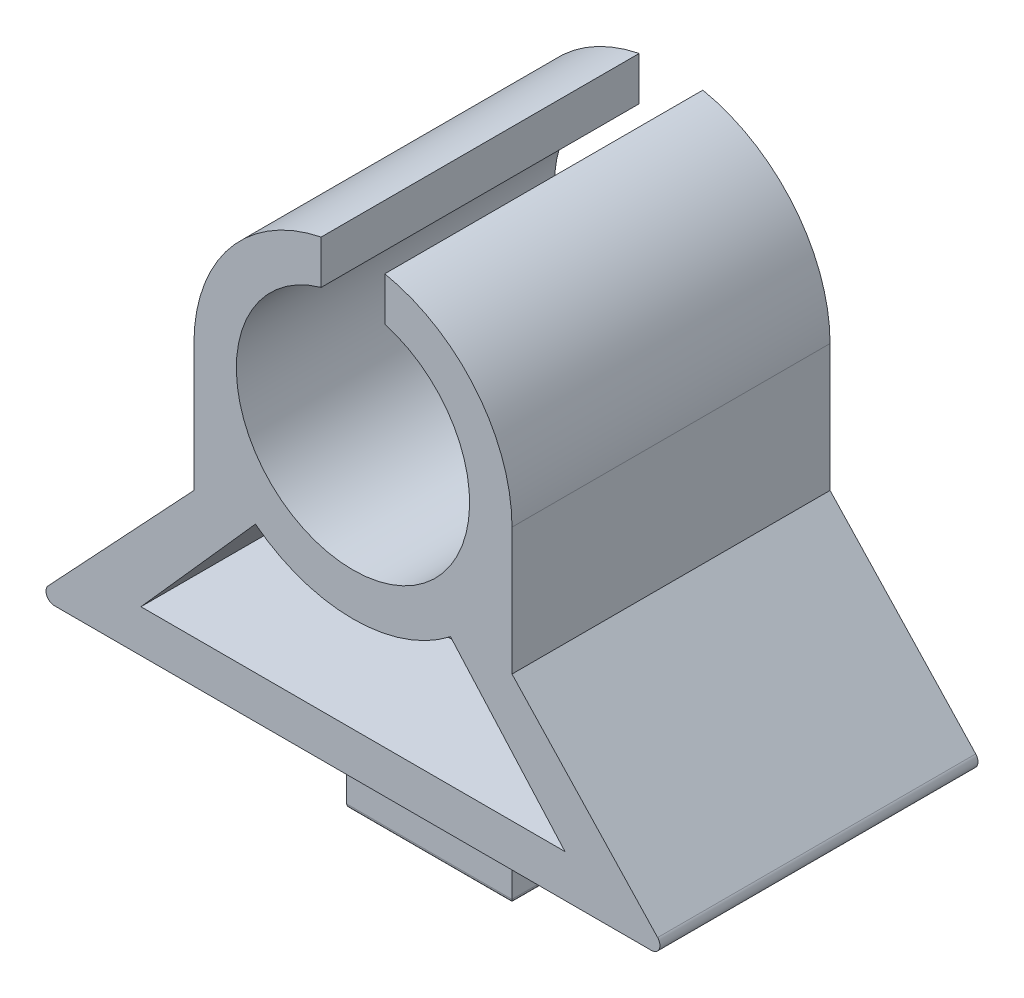
ISO-10303-21;
HEADER;
FILE_DESCRIPTION(('STEP AP214'),'2;1');
FILE_NAME('part.step','',(''),(''),'','','');
FILE_SCHEMA(('AUTOMOTIVE_DESIGN { 1 0 10303 214 1 1 1 1 }'));
ENDSEC;
DATA;
#1=APPLICATION_CONTEXT('core data for automotive mechanical design processes');
#2=APPLICATION_PROTOCOL_DEFINITION('international standard','automotive_design',2000,#1);
#3=PRODUCT_CONTEXT('',#1,'mechanical');
#4=PRODUCT('Part','Part','',(#3));
#5=PRODUCT_RELATED_PRODUCT_CATEGORY('part','',(#4));
#6=PRODUCT_DEFINITION_FORMATION('','',#4);
#7=PRODUCT_DEFINITION_CONTEXT('part definition',#1,'design');
#8=PRODUCT_DEFINITION('design','',#6,#7);
#9=PRODUCT_DEFINITION_SHAPE('','',#8);
#10=(LENGTH_UNIT() NAMED_UNIT(*) SI_UNIT(.MILLI.,.METRE.));
#11=(NAMED_UNIT(*) PLANE_ANGLE_UNIT() SI_UNIT($,.RADIAN.));
#12=(NAMED_UNIT(*) SI_UNIT($,.STERADIAN.) SOLID_ANGLE_UNIT());
#13=UNCERTAINTY_MEASURE_WITH_UNIT(LENGTH_MEASURE(1.E-05),#10,'distance_accuracy_value','');
#14=(GEOMETRIC_REPRESENTATION_CONTEXT(3) GLOBAL_UNCERTAINTY_ASSIGNED_CONTEXT((#13)) GLOBAL_UNIT_ASSIGNED_CONTEXT((#10,
#11,#12)) REPRESENTATION_CONTEXT('',''));
#15=CARTESIAN_POINT('',(0.,0.,0.));
#16=DIRECTION('',(0.,0.,1.));
#17=DIRECTION('',(1.,0.,0.));
#18=AXIS2_PLACEMENT_3D('',#15,#16,#17);
#19=CARTESIAN_POINT('',(0.,7.,-3.75));
#20=DIRECTION('',(0.,0.,1.));
#21=DIRECTION('',(1.,0.,0.));
#22=AXIS2_PLACEMENT_3D('',#19,#20,#21);
#23=PLANE('',#22);
#24=DIRECTION('',(1.,0.,0.));
#25=VECTOR('',#24,1.);
#26=CARTESIAN_POINT('',(-7.5,0.,-3.75));
#27=LINE('',#26,#25);
#28=CARTESIAN_POINT('',(-7.03835359750673,0.,-3.75));
#29=VERTEX_POINT('',#28);
#30=CARTESIAN_POINT('',(7.03835359750673,0.,-3.75));
#31=VERTEX_POINT('',#30);
#32=EDGE_CURVE('E384',#29,#31,#27,.T.);
#33=ORIENTED_EDGE('',*,*,#32,.F.);
#34=CARTESIAN_POINT('',(-7.03835359750673,0.2,-3.75));
#35=DIRECTION('',(0.,0.,1.));
#36=DIRECTION('',(1.,0.,0.));
#37=AXIS2_PLACEMENT_3D('',#34,#35,#36);
#38=CIRCLE('',#37,0.2);
#39=CARTESIAN_POINT('',(-7.18426103833475,0.336788225776266,-3.75));
#40=VERTEX_POINT('',#39);
#41=EDGE_CURVE('E444',#29,#40,#38,.F.);
#42=ORIENTED_EDGE('',*,*,#41,.T.);
#43=DIRECTION('',(-0.68394112888133,-0.729537204140085,0.));
#44=VECTOR('',#43,1.);
#45=CARTESIAN_POINT('',(-7.5,0.,-3.75));
#46=LINE('',#45,#44);
#47=CARTESIAN_POINT('',(-3.75,4.,-3.75));
#48=VERTEX_POINT('',#47);
#49=EDGE_CURVE('E381',#48,#40,#46,.T.);
#50=ORIENTED_EDGE('',*,*,#49,.F.);
#51=DIRECTION('',(0.,-1.,0.));
#52=VECTOR('',#51,1.);
#53=CARTESIAN_POINT('',(-3.75,4.,-3.75));
#54=LINE('',#53,#52);
#55=CARTESIAN_POINT('',(-3.75,7.,-3.75));
#56=VERTEX_POINT('',#55);
#57=EDGE_CURVE('E407',#56,#48,#54,.T.);
#58=ORIENTED_EDGE('',*,*,#57,.F.);
#59=CARTESIAN_POINT('',(0.,7.,-3.75));
#60=DIRECTION('',(0.,0.,1.));
#61=DIRECTION('',(1.,0.,0.));
#62=AXIS2_PLACEMENT_3D('',#59,#60,#61);
#63=CIRCLE('',#62,3.75);
#64=CARTESIAN_POINT('',(-0.75,10.6742346141748,-3.75));
#65=VERTEX_POINT('',#64);
#66=EDGE_CURVE('E404',#65,#56,#63,.T.);
#67=ORIENTED_EDGE('',*,*,#66,.F.);
#68=DIRECTION('',(0.,1.,0.));
#69=VECTOR('',#68,1.);
#70=CARTESIAN_POINT('',(-0.75,9.64575131106459,-3.75));
#71=LINE('',#70,#69);
#72=CARTESIAN_POINT('',(-0.75,9.64575131106459,-3.75));
#73=VERTEX_POINT('',#72);
#74=EDGE_CURVE('E401',#73,#65,#71,.T.);
#75=ORIENTED_EDGE('',*,*,#74,.F.);
#76=CARTESIAN_POINT('',(0.,7.,-3.75));
#77=DIRECTION('',(0.,0.,-1.));
#78=DIRECTION('',(1.,0.,0.));
#79=AXIS2_PLACEMENT_3D('',#76,#77,#78);
#80=CIRCLE('',#79,2.75);
#81=CARTESIAN_POINT('',(0.75,9.64575131106459,-3.75));
#82=VERTEX_POINT('',#81);
#83=EDGE_CURVE('E398',#82,#73,#80,.T.);
#84=ORIENTED_EDGE('',*,*,#83,.F.);
#85=DIRECTION('',(0.,-1.,0.));
#86=VECTOR('',#85,1.);
#87=CARTESIAN_POINT('',(0.75,9.64575131106459,-3.75));
#88=LINE('',#87,#86);
#89=CARTESIAN_POINT('',(0.75,10.6742346141748,-3.75));
#90=VERTEX_POINT('',#89);
#91=EDGE_CURVE('E395',#90,#82,#88,.T.);
#92=ORIENTED_EDGE('',*,*,#91,.F.);
#93=CARTESIAN_POINT('',(0.,7.,-3.75));
#94=DIRECTION('',(0.,0.,1.));
#95=DIRECTION('',(1.,0.,0.));
#96=AXIS2_PLACEMENT_3D('',#93,#94,#95);
#97=CIRCLE('',#96,3.75);
#98=CARTESIAN_POINT('',(3.75,7.,-3.75));
#99=VERTEX_POINT('',#98);
#100=EDGE_CURVE('E392',#99,#90,#97,.T.);
#101=ORIENTED_EDGE('',*,*,#100,.F.);
#102=DIRECTION('',(0.,1.,0.));
#103=VECTOR('',#102,1.);
#104=CARTESIAN_POINT('',(3.75,4.,-3.75));
#105=LINE('',#104,#103);
#106=CARTESIAN_POINT('',(3.75,4.,-3.75));
#107=VERTEX_POINT('',#106);
#108=EDGE_CURVE('E389',#107,#99,#105,.T.);
#109=ORIENTED_EDGE('',*,*,#108,.F.);
#110=DIRECTION('',(-0.68394112888133,0.729537204140085,0.));
#111=VECTOR('',#110,1.);
#112=CARTESIAN_POINT('',(3.75,4.,-3.75));
#113=LINE('',#112,#111);
#114=CARTESIAN_POINT('',(7.18426103833475,0.336788225776265,-3.75));
#115=VERTEX_POINT('',#114);
#116=EDGE_CURVE('E387',#115,#107,#113,.T.);
#117=ORIENTED_EDGE('',*,*,#116,.F.);
#118=CARTESIAN_POINT('',(7.03835359750673,0.2,-3.75));
#119=DIRECTION('',(0.,0.,1.));
#120=DIRECTION('',(1.,0.,0.));
#121=AXIS2_PLACEMENT_3D('',#118,#119,#120);
#122=CIRCLE('',#121,0.2);
#123=EDGE_CURVE('E442',#115,#31,#122,.F.);
#124=ORIENTED_EDGE('',*,*,#123,.T.);
#125=EDGE_LOOP('',(#33,#42,#50,#58,#67,#75,#84,#92,#101,#109,#117,#124));
#126=FACE_BOUND('',#125,.T.);
#127=DIRECTION('',(-0.66436383882992,-0.74740931868366,0.));
#128=VECTOR('',#127,1.);
#129=CARTESIAN_POINT('',(-5.,1.,-3.75));
#130=LINE('',#129,#128);
#131=CARTESIAN_POINT('',(-2.29965323517941,4.03789011042316,-3.75));
#132=VERTEX_POINT('',#131);
#133=CARTESIAN_POINT('',(-5.,1.,-3.75));
#134=VERTEX_POINT('',#133);
#135=EDGE_CURVE('E471',#132,#134,#130,.T.);
#136=ORIENTED_EDGE('',*,*,#135,.T.);
#137=DIRECTION('',(1.,0.,0.));
#138=VECTOR('',#137,1.);
#139=CARTESIAN_POINT('',(-5.,1.,-3.75));
#140=LINE('',#139,#138);
#141=CARTESIAN_POINT('',(5.,1.,-3.75));
#142=VERTEX_POINT('',#141);
#143=EDGE_CURVE('E254',#134,#142,#140,.T.);
#144=ORIENTED_EDGE('',*,*,#143,.T.);
#145=DIRECTION('',(-0.66436383882992,0.74740931868366,0.));
#146=VECTOR('',#145,1.);
#147=CARTESIAN_POINT('',(2.29965323517941,4.03789011042317,-3.75));
#148=LINE('',#147,#146);
#149=CARTESIAN_POINT('',(2.29965323517941,4.03789011042317,-3.75));
#150=VERTEX_POINT('',#149);
#151=EDGE_CURVE('E479',#142,#150,#148,.T.);
#152=ORIENTED_EDGE('',*,*,#151,.T.);
#153=CARTESIAN_POINT('',(0.,7.,-3.75));
#154=DIRECTION('',(0.,0.,-1.));
#155=DIRECTION('',(1.,0.,0.));
#156=AXIS2_PLACEMENT_3D('',#153,#154,#155);
#157=CIRCLE('',#156,3.75);
#158=EDGE_CURVE('E250',#150,#132,#157,.T.);
#159=ORIENTED_EDGE('',*,*,#158,.T.);
#160=EDGE_LOOP('',(#136,#144,#152,#159));
#161=FACE_BOUND('',#160,.T.);
#162=ADVANCED_FACE('F34',(#126,#161),#23,.F.);
#163=CARTESIAN_POINT('',(0.,-2.,-2.));
#164=DIRECTION('',(0.,0.,1.));
#165=DIRECTION('',(1.,0.,0.));
#166=AXIS2_PLACEMENT_3D('',#163,#164,#165);
#167=CYLINDRICAL_SURFACE('',#166,2.);
#168=DIRECTION('',(0.,0.,1.));
#169=VECTOR('',#168,1.);
#170=CARTESIAN_POINT('',(-1.95,-1.55559027913422,-2.));
#171=LINE('',#170,#169);
#172=CARTESIAN_POINT('',(-1.95,-1.55559027913422,-1.95));
#173=VERTEX_POINT('',#172);
#174=CARTESIAN_POINT('',(-1.95,-1.55559027913422,1.95));
#175=VERTEX_POINT('',#174);
#176=EDGE_CURVE('E317',#173,#175,#171,.T.);
#177=ORIENTED_EDGE('',*,*,#176,.T.);
#178=CARTESIAN_POINT('',(0.,-2.,0.));
#179=DIRECTION('',(-0.707106781186547,0.,-0.707106781186547));
#180=DIRECTION('',(-0.707106781186547,0.,0.707106781186547));
#181=AXIS2_PLACEMENT_3D('',#178,#179,#180);
#182=ELLIPSE('',#181,2.82842712474619,2.);
#183=CARTESIAN_POINT('',(-1.5,-0.677124344467705,1.5));
#184=VERTEX_POINT('',#183);
#185=EDGE_CURVE('E302',#184,#175,#182,.F.);
#186=ORIENTED_EDGE('',*,*,#185,.F.);
#187=DIRECTION('',(0.,0.,1.));
#188=VECTOR('',#187,1.);
#189=CARTESIAN_POINT('',(-1.5,-0.677124344467705,-2.));
#190=LINE('',#189,#188);
#191=CARTESIAN_POINT('',(-1.5,-0.677124344467705,-1.5));
#192=VERTEX_POINT('',#191);
#193=EDGE_CURVE('E318',#192,#184,#190,.T.);
#194=ORIENTED_EDGE('',*,*,#193,.F.);
#195=CARTESIAN_POINT('',(0.,-2.,0.));
#196=DIRECTION('',(-0.707106781186547,0.,0.707106781186547));
#197=DIRECTION('',(-0.707106781186547,0.,-0.707106781186547));
#198=AXIS2_PLACEMENT_3D('',#195,#196,#197);
#199=ELLIPSE('',#198,2.82842712474619,2.);
#200=EDGE_CURVE('E305',#173,#192,#199,.F.);
#201=ORIENTED_EDGE('',*,*,#200,.F.);
#202=EDGE_LOOP('',(#177,#186,#194,#201));
#203=FACE_BOUND('',#202,.T.);
#204=ADVANCED_FACE('F496',(#203),#167,.T.);
#205=CARTESIAN_POINT('',(0.,-2.,-2.));
#206=DIRECTION('',(0.,0.,1.));
#207=DIRECTION('',(1.,0.,0.));
#208=AXIS2_PLACEMENT_3D('',#205,#206,#207);
#209=CYLINDRICAL_SURFACE('',#208,2.);
#210=DIRECTION('',(0.,0.,1.));
#211=VECTOR('',#210,1.);
#212=CARTESIAN_POINT('',(1.5,-0.677124344467705,-2.));
#213=LINE('',#212,#211);
#214=CARTESIAN_POINT('',(1.5,-0.677124344467705,-1.5));
#215=VERTEX_POINT('',#214);
#216=CARTESIAN_POINT('',(1.5,-0.677124344467705,1.5));
#217=VERTEX_POINT('',#216);
#218=EDGE_CURVE('E322',#215,#217,#213,.T.);
#219=ORIENTED_EDGE('',*,*,#218,.T.);
#220=CARTESIAN_POINT('',(0.,-2.,0.));
#221=DIRECTION('',(-0.707106781186547,0.,0.707106781186547));
#222=DIRECTION('',(-0.707106781186547,0.,-0.707106781186547));
#223=AXIS2_PLACEMENT_3D('',#220,#221,#222);
#224=ELLIPSE('',#223,2.82842712474619,2.);
#225=CARTESIAN_POINT('',(1.95,-1.55559027913422,1.95));
#226=VERTEX_POINT('',#225);
#227=EDGE_CURVE('E298',#226,#217,#224,.T.);
#228=ORIENTED_EDGE('',*,*,#227,.F.);
#229=DIRECTION('',(0.,0.,1.));
#230=VECTOR('',#229,1.);
#231=CARTESIAN_POINT('',(1.95,-1.55559027913422,-2.));
#232=LINE('',#231,#230);
#233=CARTESIAN_POINT('',(1.95,-1.55559027913422,-1.95));
#234=VERTEX_POINT('',#233);
#235=EDGE_CURVE('E325',#234,#226,#232,.T.);
#236=ORIENTED_EDGE('',*,*,#235,.F.);
#237=CARTESIAN_POINT('',(0.,-2.,0.));
#238=DIRECTION('',(-0.707106781186547,0.,-0.707106781186547));
#239=DIRECTION('',(-0.707106781186547,0.,0.707106781186547));
#240=AXIS2_PLACEMENT_3D('',#237,#238,#239);
#241=ELLIPSE('',#240,2.82842712474619,2.);
#242=EDGE_CURVE('E307',#215,#234,#241,.T.);
#243=ORIENTED_EDGE('',*,*,#242,.F.);
#244=EDGE_LOOP('',(#219,#228,#236,#243));
#245=FACE_BOUND('',#244,.T.);
#246=ADVANCED_FACE('F502',(#245),#209,.T.);
#247=CARTESIAN_POINT('',(1.95,-2.5,-2.));
#248=DIRECTION('',(1.,0.,0.));
#249=DIRECTION('',(0.,0.,-1.));
#250=AXIS2_PLACEMENT_3D('',#247,#248,#249);
#251=PLANE('',#250);
#252=DIRECTION('',(0.,1.,0.));
#253=VECTOR('',#252,1.);
#254=CARTESIAN_POINT('',(1.95,-2.5,1.95));
#255=LINE('',#254,#253);
#256=CARTESIAN_POINT('',(1.95,-2.4,1.95));
#257=VERTEX_POINT('',#256);
#258=EDGE_CURVE('E300',#257,#226,#255,.T.);
#259=ORIENTED_EDGE('',*,*,#258,.F.);
#260=DIRECTION('',(0.,0.,1.));
#261=VECTOR('',#260,1.);
#262=CARTESIAN_POINT('',(1.95,-2.4,-2.));
#263=LINE('',#262,#261);
#264=CARTESIAN_POINT('',(1.95,-2.4,-1.95));
#265=VERTEX_POINT('',#264);
#266=EDGE_CURVE('E11',#257,#265,#263,.F.);
#267=ORIENTED_EDGE('',*,*,#266,.T.);
#268=DIRECTION('',(0.,1.,0.));
#269=VECTOR('',#268,1.);
#270=CARTESIAN_POINT('',(1.95,-2.5,-1.95));
#271=LINE('',#270,#269);
#272=EDGE_CURVE('E310',#265,#234,#271,.T.);
#273=ORIENTED_EDGE('',*,*,#272,.T.);
#274=ORIENTED_EDGE('',*,*,#235,.T.);
#275=EDGE_LOOP('',(#259,#267,#273,#274));
#276=FACE_BOUND('',#275,.T.);
#277=ADVANCED_FACE('F582',(#276),#251,.T.);
#278=CARTESIAN_POINT('',(-1.95,-2.5,-2.));
#279=DIRECTION('',(0.,-1.,0.));
#280=DIRECTION('',(0.,0.,-1.));
#281=AXIS2_PLACEMENT_3D('',#278,#279,#280);
#282=PLANE('',#281);
#283=DIRECTION('',(0.,0.,1.));
#284=VECTOR('',#283,1.);
#285=CARTESIAN_POINT('',(-1.85,-2.5,-2.));
#286=LINE('',#285,#284);
#287=CARTESIAN_POINT('',(-1.85,-2.5,1.85));
#288=VERTEX_POINT('',#287);
#289=CARTESIAN_POINT('',(-1.85,-2.5,-1.85));
#290=VERTEX_POINT('',#289);
#291=EDGE_CURVE('E455',#288,#290,#286,.F.);
#292=ORIENTED_EDGE('',*,*,#291,.T.);
#293=DIRECTION('',(-1.,0.,0.));
#294=VECTOR('',#293,1.);
#295=CARTESIAN_POINT('',(1.95,-2.5,-1.85));
#296=LINE('',#295,#294);
#297=CARTESIAN_POINT('',(1.85,-2.5,-1.85));
#298=VERTEX_POINT('',#297);
#299=EDGE_CURVE('E457',#290,#298,#296,.F.);
#300=ORIENTED_EDGE('',*,*,#299,.T.);
#301=DIRECTION('',(0.,0.,1.));
#302=VECTOR('',#301,1.);
#303=CARTESIAN_POINT('',(1.85,-2.5,-2.));
#304=LINE('',#303,#302);
#305=CARTESIAN_POINT('',(1.85,-2.5,1.85));
#306=VERTEX_POINT('',#305);
#307=EDGE_CURVE('E451',#298,#306,#304,.T.);
#308=ORIENTED_EDGE('',*,*,#307,.T.);
#309=DIRECTION('',(-1.,0.,0.));
#310=VECTOR('',#309,1.);
#311=CARTESIAN_POINT('',(-1.95,-2.5,1.85));
#312=LINE('',#311,#310);
#313=EDGE_CURVE('E453',#306,#288,#312,.T.);
#314=ORIENTED_EDGE('',*,*,#313,.T.);
#315=EDGE_LOOP('',(#292,#300,#308,#314));
#316=FACE_BOUND('',#315,.T.);
#317=ADVANCED_FACE('F577',(#316),#282,.T.);
#318=CARTESIAN_POINT('',(-1.95,-2.5,-2.));
#319=DIRECTION('',(-1.,0.,0.));
#320=DIRECTION('',(0.,0.,1.));
#321=AXIS2_PLACEMENT_3D('',#318,#319,#320);
#322=PLANE('',#321);
#323=DIRECTION('',(0.,1.,0.));
#324=VECTOR('',#323,1.);
#325=CARTESIAN_POINT('',(-1.95,-2.5,-1.95));
#326=LINE('',#325,#324);
#327=CARTESIAN_POINT('',(-1.95,-2.4,-1.95));
#328=VERTEX_POINT('',#327);
#329=EDGE_CURVE('E312',#328,#173,#326,.T.);
#330=ORIENTED_EDGE('',*,*,#329,.F.);
#331=DIRECTION('',(0.,0.,1.));
#332=VECTOR('',#331,1.);
#333=CARTESIAN_POINT('',(-1.95,-2.4,-2.));
#334=LINE('',#333,#332);
#335=CARTESIAN_POINT('',(-1.95,-2.4,1.95));
#336=VERTEX_POINT('',#335);
#337=EDGE_CURVE('E58',#328,#336,#334,.T.);
#338=ORIENTED_EDGE('',*,*,#337,.T.);
#339=DIRECTION('',(0.,1.,0.));
#340=VECTOR('',#339,1.);
#341=CARTESIAN_POINT('',(-1.95,-2.5,1.95));
#342=LINE('',#341,#340);
#343=EDGE_CURVE('E296',#336,#175,#342,.T.);
#344=ORIENTED_EDGE('',*,*,#343,.T.);
#345=ORIENTED_EDGE('',*,*,#176,.F.);
#346=EDGE_LOOP('',(#330,#338,#344,#345));
#347=FACE_BOUND('',#346,.T.);
#348=ADVANCED_FACE('F546',(#347),#322,.T.);
#349=CARTESIAN_POINT('',(-7.5,0.,-3.75));
#350=DIRECTION('',(0.,-1.,0.));
#351=DIRECTION('',(0.,0.,-1.));
#352=AXIS2_PLACEMENT_3D('',#349,#350,#351);
#353=PLANE('',#352);
#354=DIRECTION('',(1.,0.,0.));
#355=VECTOR('',#354,1.);
#356=CARTESIAN_POINT('',(-7.5,0.,3.75));
#357=LINE('',#356,#355);
#358=CARTESIAN_POINT('',(-7.03835359750673,0.,3.75));
#359=VERTEX_POINT('',#358);
#360=CARTESIAN_POINT('',(7.03835359750673,0.,3.75));
#361=VERTEX_POINT('',#360);
#362=EDGE_CURVE('E355',#359,#361,#357,.T.);
#363=ORIENTED_EDGE('',*,*,#362,.F.);
#364=DIRECTION('',(0.,0.,1.));
#365=VECTOR('',#364,1.);
#366=CARTESIAN_POINT('',(-7.03835359750673,0.,-3.75));
#367=LINE('',#366,#365);
#368=EDGE_CURVE('E440',#359,#29,#367,.F.);
#369=ORIENTED_EDGE('',*,*,#368,.T.);
#370=ORIENTED_EDGE('',*,*,#32,.T.);
#371=DIRECTION('',(0.,0.,1.));
#372=VECTOR('',#371,1.);
#373=CARTESIAN_POINT('',(7.03835359750673,0.,-3.75));
#374=LINE('',#373,#372);
#375=EDGE_CURVE('E437',#31,#361,#374,.T.);
#376=ORIENTED_EDGE('',*,*,#375,.T.);
#377=EDGE_LOOP('',(#363,#369,#370,#376));
#378=FACE_BOUND('',#377,.T.);
#379=DIRECTION('',(1.,0.,0.));
#380=VECTOR('',#379,1.);
#381=CARTESIAN_POINT('',(-1.5,0.,-1.5));
#382=LINE('',#381,#380);
#383=CARTESIAN_POINT('',(-1.5,0.,-1.5));
#384=VERTEX_POINT('',#383);
#385=CARTESIAN_POINT('',(1.5,0.,-1.5));
#386=VERTEX_POINT('',#385);
#387=EDGE_CURVE('E335',#384,#386,#382,.T.);
#388=ORIENTED_EDGE('',*,*,#387,.F.);
#389=DIRECTION('',(0.,0.,-1.));
#390=VECTOR('',#389,1.);
#391=CARTESIAN_POINT('',(-1.5,0.,1.5));
#392=LINE('',#391,#390);
#393=CARTESIAN_POINT('',(-1.5,0.,1.5));
#394=VERTEX_POINT('',#393);
#395=EDGE_CURVE('E332',#394,#384,#392,.T.);
#396=ORIENTED_EDGE('',*,*,#395,.F.);
#397=DIRECTION('',(-1.,0.,0.));
#398=VECTOR('',#397,1.);
#399=CARTESIAN_POINT('',(-1.5,0.,1.5));
#400=LINE('',#399,#398);
#401=CARTESIAN_POINT('',(1.5,0.,1.5));
#402=VERTEX_POINT('',#401);
#403=EDGE_CURVE('E341',#402,#394,#400,.T.);
#404=ORIENTED_EDGE('',*,*,#403,.F.);
#405=DIRECTION('',(0.,0.,1.));
#406=VECTOR('',#405,1.);
#407=CARTESIAN_POINT('',(1.5,0.,1.5));
#408=LINE('',#407,#406);
#409=EDGE_CURVE('E338',#386,#402,#408,.T.);
#410=ORIENTED_EDGE('',*,*,#409,.F.);
#411=EDGE_LOOP('',(#388,#396,#404,#410));
#412=FACE_BOUND('',#411,.T.);
#413=ADVANCED_FACE('F543',(#378,#412),#353,.T.);
#414=CARTESIAN_POINT('',(-7.5,0.,-3.75));
#415=DIRECTION('',(-0.729537204140085,0.68394112888133,0.));
#416=DIRECTION('',(-0.68394112888133,-0.729537204140085,0.));
#417=AXIS2_PLACEMENT_3D('',#414,#415,#416);
#418=PLANE('',#417);
#419=ORIENTED_EDGE('',*,*,#49,.T.);
#420=DIRECTION('',(0.,0.,1.));
#421=VECTOR('',#420,1.);
#422=CARTESIAN_POINT('',(-7.18426103833475,0.336788225776266,-3.75));
#423=LINE('',#422,#421);
#424=CARTESIAN_POINT('',(-7.18426103833475,0.336788225776266,3.75));
#425=VERTEX_POINT('',#424);
#426=EDGE_CURVE('E430',#40,#425,#423,.T.);
#427=ORIENTED_EDGE('',*,*,#426,.T.);
#428=DIRECTION('',(-0.68394112888133,-0.729537204140085,0.));
#429=VECTOR('',#428,1.);
#430=CARTESIAN_POINT('',(-7.5,0.,3.75));
#431=LINE('',#430,#429);
#432=CARTESIAN_POINT('',(-3.75,4.,3.75));
#433=VERTEX_POINT('',#432);
#434=EDGE_CURVE('E352',#433,#425,#431,.T.);
#435=ORIENTED_EDGE('',*,*,#434,.F.);
#436=DIRECTION('',(0.,0.,1.));
#437=VECTOR('',#436,1.);
#438=CARTESIAN_POINT('',(-3.75,4.,-3.75));
#439=LINE('',#438,#437);
#440=EDGE_CURVE('E411',#48,#433,#439,.T.);
#441=ORIENTED_EDGE('',*,*,#440,.F.);
#442=EDGE_LOOP('',(#419,#427,#435,#441));
#443=FACE_BOUND('',#442,.T.);
#444=ADVANCED_FACE('F514',(#443),#418,.T.);
#445=CARTESIAN_POINT('',(-3.75,4.,-3.75));
#446=DIRECTION('',(-1.,0.,0.));
#447=DIRECTION('',(0.,0.,1.));
#448=AXIS2_PLACEMENT_3D('',#445,#446,#447);
#449=PLANE('',#448);
#450=ORIENTED_EDGE('',*,*,#440,.T.);
#451=DIRECTION('',(0.,-1.,0.));
#452=VECTOR('',#451,1.);
#453=CARTESIAN_POINT('',(-3.75,4.,3.75));
#454=LINE('',#453,#452);
#455=CARTESIAN_POINT('',(-3.75,7.,3.75));
#456=VERTEX_POINT('',#455);
#457=EDGE_CURVE('E378',#456,#433,#454,.T.);
#458=ORIENTED_EDGE('',*,*,#457,.F.);
#459=DIRECTION('',(0.,0.,1.));
#460=VECTOR('',#459,1.);
#461=CARTESIAN_POINT('',(-3.75,7.,-3.75));
#462=LINE('',#461,#460);
#463=EDGE_CURVE('E414',#56,#456,#462,.T.);
#464=ORIENTED_EDGE('',*,*,#463,.F.);
#465=ORIENTED_EDGE('',*,*,#57,.T.);
#466=EDGE_LOOP('',(#450,#458,#464,#465));
#467=FACE_BOUND('',#466,.T.);
#468=ADVANCED_FACE('F510',(#467),#449,.T.);
#469=CARTESIAN_POINT('',(0.,7.,-3.75));
#470=DIRECTION('',(0.,0.,1.));
#471=DIRECTION('',(1.,0.,0.));
#472=AXIS2_PLACEMENT_3D('',#469,#470,#471);
#473=CYLINDRICAL_SURFACE('',#472,3.75);
#474=ORIENTED_EDGE('',*,*,#463,.T.);
#475=CARTESIAN_POINT('',(0.,7.,3.75));
#476=DIRECTION('',(0.,0.,1.));
#477=DIRECTION('',(1.,0.,0.));
#478=AXIS2_PLACEMENT_3D('',#475,#476,#477);
#479=CIRCLE('',#478,3.75);
#480=CARTESIAN_POINT('',(-0.75,10.6742346141748,3.75));
#481=VERTEX_POINT('',#480);
#482=EDGE_CURVE('E375',#481,#456,#479,.T.);
#483=ORIENTED_EDGE('',*,*,#482,.F.);
#484=DIRECTION('',(0.,0.,1.));
#485=VECTOR('',#484,1.);
#486=CARTESIAN_POINT('',(-0.75,10.6742346141748,-3.75));
#487=LINE('',#486,#485);
#488=EDGE_CURVE('E416',#65,#481,#487,.T.);
#489=ORIENTED_EDGE('',*,*,#488,.F.);
#490=ORIENTED_EDGE('',*,*,#66,.T.);
#491=EDGE_LOOP('',(#474,#483,#489,#490));
#492=FACE_BOUND('',#491,.T.);
#493=ADVANCED_FACE('F513',(#492),#473,.T.);
#494=CARTESIAN_POINT('',(-0.75,9.64575131106459,-3.75));
#495=DIRECTION('',(1.,0.,0.));
#496=DIRECTION('',(0.,0.,-1.));
#497=AXIS2_PLACEMENT_3D('',#494,#495,#496);
#498=PLANE('',#497);
#499=ORIENTED_EDGE('',*,*,#488,.T.);
#500=DIRECTION('',(0.,1.,0.));
#501=VECTOR('',#500,1.);
#502=CARTESIAN_POINT('',(-0.75,9.64575131106459,3.75));
#503=LINE('',#502,#501);
#504=CARTESIAN_POINT('',(-0.75,9.64575131106459,3.75));
#505=VERTEX_POINT('',#504);
#506=EDGE_CURVE('E372',#505,#481,#503,.T.);
#507=ORIENTED_EDGE('',*,*,#506,.F.);
#508=DIRECTION('',(0.,0.,1.));
#509=VECTOR('',#508,1.);
#510=CARTESIAN_POINT('',(-0.75,9.64575131106459,-3.75));
#511=LINE('',#510,#509);
#512=EDGE_CURVE('E418',#73,#505,#511,.T.);
#513=ORIENTED_EDGE('',*,*,#512,.F.);
#514=ORIENTED_EDGE('',*,*,#74,.T.);
#515=EDGE_LOOP('',(#499,#507,#513,#514));
#516=FACE_BOUND('',#515,.T.);
#517=ADVANCED_FACE('F518',(#516),#498,.T.);
#518=CARTESIAN_POINT('',(0.,7.,-3.75));
#519=DIRECTION('',(0.,0.,1.));
#520=DIRECTION('',(1.,0.,0.));
#521=AXIS2_PLACEMENT_3D('',#518,#519,#520);
#522=CYLINDRICAL_SURFACE('',#521,2.75);
#523=ORIENTED_EDGE('',*,*,#512,.T.);
#524=CARTESIAN_POINT('',(0.,7.,3.75));
#525=DIRECTION('',(0.,0.,-1.));
#526=DIRECTION('',(1.,0.,0.));
#527=AXIS2_PLACEMENT_3D('',#524,#525,#526);
#528=CIRCLE('',#527,2.75);
#529=CARTESIAN_POINT('',(0.75,9.64575131106459,3.75));
#530=VERTEX_POINT('',#529);
#531=EDGE_CURVE('E369',#530,#505,#528,.T.);
#532=ORIENTED_EDGE('',*,*,#531,.F.);
#533=DIRECTION('',(0.,0.,1.));
#534=VECTOR('',#533,1.);
#535=CARTESIAN_POINT('',(0.75,9.64575131106459,-3.75));
#536=LINE('',#535,#534);
#537=EDGE_CURVE('E420',#82,#530,#536,.T.);
#538=ORIENTED_EDGE('',*,*,#537,.F.);
#539=ORIENTED_EDGE('',*,*,#83,.T.);
#540=EDGE_LOOP('',(#523,#532,#538,#539));
#541=FACE_BOUND('',#540,.T.);
#542=ADVANCED_FACE('F522',(#541),#522,.F.);
#543=CARTESIAN_POINT('',(0.75,9.64575131106459,-3.75));
#544=DIRECTION('',(-1.,0.,0.));
#545=DIRECTION('',(0.,0.,1.));
#546=AXIS2_PLACEMENT_3D('',#543,#544,#545);
#547=PLANE('',#546);
#548=ORIENTED_EDGE('',*,*,#537,.T.);
#549=DIRECTION('',(0.,-1.,0.));
#550=VECTOR('',#549,1.);
#551=CARTESIAN_POINT('',(0.75,9.64575131106459,3.75));
#552=LINE('',#551,#550);
#553=CARTESIAN_POINT('',(0.75,10.6742346141748,3.75));
#554=VERTEX_POINT('',#553);
#555=EDGE_CURVE('E366',#554,#530,#552,.T.);
#556=ORIENTED_EDGE('',*,*,#555,.F.);
#557=DIRECTION('',(0.,0.,1.));
#558=VECTOR('',#557,1.);
#559=CARTESIAN_POINT('',(0.75,10.6742346141748,-3.75));
#560=LINE('',#559,#558);
#561=EDGE_CURVE('E422',#90,#554,#560,.T.);
#562=ORIENTED_EDGE('',*,*,#561,.F.);
#563=ORIENTED_EDGE('',*,*,#91,.T.);
#564=EDGE_LOOP('',(#548,#556,#562,#563));
#565=FACE_BOUND('',#564,.T.);
#566=ADVANCED_FACE('F526',(#565),#547,.T.);
#567=CARTESIAN_POINT('',(0.,7.,-3.75));
#568=DIRECTION('',(0.,0.,1.));
#569=DIRECTION('',(1.,0.,0.));
#570=AXIS2_PLACEMENT_3D('',#567,#568,#569);
#571=CYLINDRICAL_SURFACE('',#570,3.75);
#572=ORIENTED_EDGE('',*,*,#561,.T.);
#573=CARTESIAN_POINT('',(0.,7.,3.75));
#574=DIRECTION('',(0.,0.,1.));
#575=DIRECTION('',(1.,0.,0.));
#576=AXIS2_PLACEMENT_3D('',#573,#574,#575);
#577=CIRCLE('',#576,3.75);
#578=CARTESIAN_POINT('',(3.75,7.,3.75));
#579=VERTEX_POINT('',#578);
#580=EDGE_CURVE('E363',#579,#554,#577,.T.);
#581=ORIENTED_EDGE('',*,*,#580,.F.);
#582=DIRECTION('',(0.,0.,1.));
#583=VECTOR('',#582,1.);
#584=CARTESIAN_POINT('',(3.75,7.,-3.75));
#585=LINE('',#584,#583);
#586=EDGE_CURVE('E424',#99,#579,#585,.T.);
#587=ORIENTED_EDGE('',*,*,#586,.F.);
#588=ORIENTED_EDGE('',*,*,#100,.T.);
#589=EDGE_LOOP('',(#572,#581,#587,#588));
#590=FACE_BOUND('',#589,.T.);
#591=ADVANCED_FACE('F530',(#590),#571,.T.);
#592=CARTESIAN_POINT('',(3.75,4.,-3.75));
#593=DIRECTION('',(1.,0.,0.));
#594=DIRECTION('',(0.,0.,-1.));
#595=AXIS2_PLACEMENT_3D('',#592,#593,#594);
#596=PLANE('',#595);
#597=ORIENTED_EDGE('',*,*,#586,.T.);
#598=DIRECTION('',(0.,1.,0.));
#599=VECTOR('',#598,1.);
#600=CARTESIAN_POINT('',(3.75,4.,3.75));
#601=LINE('',#600,#599);
#602=CARTESIAN_POINT('',(3.75,4.,3.75));
#603=VERTEX_POINT('',#602);
#604=EDGE_CURVE('E360',#603,#579,#601,.T.);
#605=ORIENTED_EDGE('',*,*,#604,.F.);
#606=DIRECTION('',(0.,0.,1.));
#607=VECTOR('',#606,1.);
#608=CARTESIAN_POINT('',(3.75,4.,-3.75));
#609=LINE('',#608,#607);
#610=EDGE_CURVE('E410',#107,#603,#609,.T.);
#611=ORIENTED_EDGE('',*,*,#610,.F.);
#612=ORIENTED_EDGE('',*,*,#108,.T.);
#613=EDGE_LOOP('',(#597,#605,#611,#612));
#614=FACE_BOUND('',#613,.T.);
#615=ADVANCED_FACE('F534',(#614),#596,.T.);
#616=CARTESIAN_POINT('',(3.75,4.,-3.75));
#617=DIRECTION('',(0.729537204140085,0.68394112888133,0.));
#618=DIRECTION('',(-0.68394112888133,0.729537204140085,0.));
#619=AXIS2_PLACEMENT_3D('',#616,#617,#618);
#620=PLANE('',#619);
#621=DIRECTION('',(-0.68394112888133,0.729537204140085,0.));
#622=VECTOR('',#621,1.);
#623=CARTESIAN_POINT('',(3.75,4.,3.75));
#624=LINE('',#623,#622);
#625=CARTESIAN_POINT('',(7.18426103833475,0.336788225776265,3.75));
#626=VERTEX_POINT('',#625);
#627=EDGE_CURVE('E358',#626,#603,#624,.T.);
#628=ORIENTED_EDGE('',*,*,#627,.F.);
#629=DIRECTION('',(0.,0.,1.));
#630=VECTOR('',#629,1.);
#631=CARTESIAN_POINT('',(7.18426103833475,0.336788225776265,-3.75));
#632=LINE('',#631,#630);
#633=EDGE_CURVE('E446',#626,#115,#632,.F.);
#634=ORIENTED_EDGE('',*,*,#633,.T.);
#635=ORIENTED_EDGE('',*,*,#116,.T.);
#636=ORIENTED_EDGE('',*,*,#610,.T.);
#637=EDGE_LOOP('',(#628,#634,#635,#636));
#638=FACE_BOUND('',#637,.T.);
#639=ADVANCED_FACE('F538',(#638),#620,.T.);
#640=CARTESIAN_POINT('',(0.,7.,3.75));
#641=DIRECTION('',(0.,0.,1.));
#642=DIRECTION('',(1.,0.,0.));
#643=AXIS2_PLACEMENT_3D('',#640,#641,#642);
#644=PLANE('',#643);
#645=DIRECTION('',(-0.66436383882992,-0.74740931868366,0.));
#646=VECTOR('',#645,1.);
#647=CARTESIAN_POINT('',(-5.,1.,3.75));
#648=LINE('',#647,#646);
#649=CARTESIAN_POINT('',(-2.29965323517941,4.03789011042316,3.75));
#650=VERTEX_POINT('',#649);
#651=CARTESIAN_POINT('',(-5.,1.,3.75));
#652=VERTEX_POINT('',#651);
#653=EDGE_CURVE('E255',#650,#652,#648,.T.);
#654=ORIENTED_EDGE('',*,*,#653,.F.);
#655=CARTESIAN_POINT('',(0.,7.,3.75));
#656=DIRECTION('',(0.,0.,-1.));
#657=DIRECTION('',(1.,0.,0.));
#658=AXIS2_PLACEMENT_3D('',#655,#656,#657);
#659=CIRCLE('',#658,3.75);
#660=CARTESIAN_POINT('',(2.29965323517941,4.03789011042317,3.75));
#661=VERTEX_POINT('',#660);
#662=EDGE_CURVE('E268',#661,#650,#659,.T.);
#663=ORIENTED_EDGE('',*,*,#662,.F.);
#664=DIRECTION('',(-0.66436383882992,0.74740931868366,0.));
#665=VECTOR('',#664,1.);
#666=CARTESIAN_POINT('',(2.29965323517941,4.03789011042317,3.75));
#667=LINE('',#666,#665);
#668=CARTESIAN_POINT('',(5.,1.,3.75));
#669=VERTEX_POINT('',#668);
#670=EDGE_CURVE('E280',#669,#661,#667,.T.);
#671=ORIENTED_EDGE('',*,*,#670,.F.);
#672=DIRECTION('',(1.,0.,0.));
#673=VECTOR('',#672,1.);
#674=CARTESIAN_POINT('',(-5.,1.,3.75));
#675=LINE('',#674,#673);
#676=EDGE_CURVE('E258',#652,#669,#675,.T.);
#677=ORIENTED_EDGE('',*,*,#676,.F.);
#678=EDGE_LOOP('',(#654,#663,#671,#677));
#679=FACE_BOUND('',#678,.T.);
#680=ORIENTED_EDGE('',*,*,#434,.T.);
#681=CARTESIAN_POINT('',(-7.03835359750673,0.2,3.75));
#682=DIRECTION('',(0.,0.,1.));
#683=DIRECTION('',(1.,0.,0.));
#684=AXIS2_PLACEMENT_3D('',#681,#682,#683);
#685=CIRCLE('',#684,0.2);
#686=EDGE_CURVE('E435',#425,#359,#685,.T.);
#687=ORIENTED_EDGE('',*,*,#686,.T.);
#688=ORIENTED_EDGE('',*,*,#362,.T.);
#689=CARTESIAN_POINT('',(7.03835359750673,0.2,3.75));
#690=DIRECTION('',(0.,0.,1.));
#691=DIRECTION('',(1.,0.,0.));
#692=AXIS2_PLACEMENT_3D('',#689,#690,#691);
#693=CIRCLE('',#692,0.2);
#694=EDGE_CURVE('E433',#361,#626,#693,.T.);
#695=ORIENTED_EDGE('',*,*,#694,.T.);
#696=ORIENTED_EDGE('',*,*,#627,.T.);
#697=ORIENTED_EDGE('',*,*,#604,.T.);
#698=ORIENTED_EDGE('',*,*,#580,.T.);
#699=ORIENTED_EDGE('',*,*,#555,.T.);
#700=ORIENTED_EDGE('',*,*,#531,.T.);
#701=ORIENTED_EDGE('',*,*,#506,.T.);
#702=ORIENTED_EDGE('',*,*,#482,.T.);
#703=ORIENTED_EDGE('',*,*,#457,.T.);
#704=EDGE_LOOP('',(#680,#687,#688,#695,#696,#697,#698,#699,#700,#701,#702,#703));
#705=FACE_BOUND('',#704,.T.);
#706=ADVANCED_FACE('F508',(#679,#705),#644,.T.);
#707=CARTESIAN_POINT('',(-1.5,-1.,1.5));
#708=DIRECTION('',(1.,0.,0.));
#709=DIRECTION('',(0.,0.,-1.));
#710=AXIS2_PLACEMENT_3D('',#707,#708,#709);
#711=PLANE('',#710);
#712=DIRECTION('',(0.,1.,0.));
#713=VECTOR('',#712,1.);
#714=CARTESIAN_POINT('',(-1.5,-1.,-1.5));
#715=LINE('',#714,#713);
#716=EDGE_CURVE('E350',#192,#384,#715,.T.);
#717=ORIENTED_EDGE('',*,*,#716,.F.);
#718=ORIENTED_EDGE('',*,*,#193,.T.);
#719=DIRECTION('',(0.,1.,0.));
#720=VECTOR('',#719,1.);
#721=CARTESIAN_POINT('',(-1.5,-1.,1.5));
#722=LINE('',#721,#720);
#723=EDGE_CURVE('E344',#184,#394,#722,.T.);
#724=ORIENTED_EDGE('',*,*,#723,.T.);
#725=ORIENTED_EDGE('',*,*,#395,.T.);
#726=EDGE_LOOP('',(#717,#718,#724,#725));
#727=FACE_BOUND('',#726,.T.);
#728=ADVANCED_FACE('F606',(#727),#711,.F.);
#729=CARTESIAN_POINT('',(-1.5,-1.,-1.5));
#730=DIRECTION('',(0.,0.,1.));
#731=DIRECTION('',(1.,0.,0.));
#732=AXIS2_PLACEMENT_3D('',#729,#730,#731);
#733=PLANE('',#732);
#734=DIRECTION('',(0.,1.,0.));
#735=VECTOR('',#734,1.);
#736=CARTESIAN_POINT('',(1.5,-1.,-1.5));
#737=LINE('',#736,#735);
#738=EDGE_CURVE('E348',#215,#386,#737,.T.);
#739=ORIENTED_EDGE('',*,*,#738,.F.);
#740=DIRECTION('',(-1.,0.,0.));
#741=VECTOR('',#740,1.);
#742=CARTESIAN_POINT('',(-1.5,-0.677124344467705,-1.5));
#743=LINE('',#742,#741);
#744=EDGE_CURVE('E321',#215,#192,#743,.T.);
#745=ORIENTED_EDGE('',*,*,#744,.T.);
#746=ORIENTED_EDGE('',*,*,#716,.T.);
#747=ORIENTED_EDGE('',*,*,#387,.T.);
#748=EDGE_LOOP('',(#739,#745,#746,#747));
#749=FACE_BOUND('',#748,.T.);
#750=ADVANCED_FACE('F604',(#749),#733,.F.);
#751=CARTESIAN_POINT('',(1.5,-1.,1.5));
#752=DIRECTION('',(-1.,0.,0.));
#753=DIRECTION('',(0.,0.,1.));
#754=AXIS2_PLACEMENT_3D('',#751,#752,#753);
#755=PLANE('',#754);
#756=DIRECTION('',(0.,1.,0.));
#757=VECTOR('',#756,1.);
#758=CARTESIAN_POINT('',(1.5,-1.,1.5));
#759=LINE('',#758,#757);
#760=EDGE_CURVE('E346',#217,#402,#759,.T.);
#761=ORIENTED_EDGE('',*,*,#760,.F.);
#762=ORIENTED_EDGE('',*,*,#218,.F.);
#763=ORIENTED_EDGE('',*,*,#738,.T.);
#764=ORIENTED_EDGE('',*,*,#409,.T.);
#765=EDGE_LOOP('',(#761,#762,#763,#764));
#766=FACE_BOUND('',#765,.T.);
#767=ADVANCED_FACE('F615',(#766),#755,.F.);
#768=CARTESIAN_POINT('',(-1.5,-1.,1.5));
#769=DIRECTION('',(0.,0.,-1.));
#770=DIRECTION('',(-1.,0.,0.));
#771=AXIS2_PLACEMENT_3D('',#768,#769,#770);
#772=PLANE('',#771);
#773=ORIENTED_EDGE('',*,*,#723,.F.);
#774=DIRECTION('',(1.,0.,0.));
#775=VECTOR('',#774,1.);
#776=CARTESIAN_POINT('',(-1.5,-0.677124344467705,1.5));
#777=LINE('',#776,#775);
#778=EDGE_CURVE('E413',#184,#217,#777,.T.);
#779=ORIENTED_EDGE('',*,*,#778,.T.);
#780=ORIENTED_EDGE('',*,*,#760,.T.);
#781=ORIENTED_EDGE('',*,*,#403,.T.);
#782=EDGE_LOOP('',(#773,#779,#780,#781));
#783=FACE_BOUND('',#782,.T.);
#784=ADVANCED_FACE('F617',(#783),#772,.F.);
#785=CARTESIAN_POINT('',(7.501,-2.,0.));
#786=DIRECTION('',(-1.,0.,0.));
#787=DIRECTION('',(0.,0.,1.));
#788=AXIS2_PLACEMENT_3D('',#785,#786,#787);
#789=CYLINDRICAL_SURFACE('',#788,2.);
#790=ORIENTED_EDGE('',*,*,#200,.T.);
#791=ORIENTED_EDGE('',*,*,#744,.F.);
#792=ORIENTED_EDGE('',*,*,#242,.T.);
#793=DIRECTION('',(-1.,0.,0.));
#794=VECTOR('',#793,1.);
#795=CARTESIAN_POINT('',(7.501,-1.55559027913422,-1.95));
#796=LINE('',#795,#794);
#797=EDGE_CURVE('E314',#234,#173,#796,.T.);
#798=ORIENTED_EDGE('',*,*,#797,.T.);
#799=EDGE_LOOP('',(#790,#791,#792,#798));
#800=FACE_BOUND('',#799,.T.);
#801=ADVANCED_FACE('F600',(#800),#789,.T.);
#802=CARTESIAN_POINT('',(7.501,-2.5,-1.95));
#803=DIRECTION('',(0.,0.,1.));
#804=DIRECTION('',(1.,0.,0.));
#805=AXIS2_PLACEMENT_3D('',#802,#803,#804);
#806=PLANE('',#805);
#807=ORIENTED_EDGE('',*,*,#272,.F.);
#808=DIRECTION('',(-1.,0.,0.));
#809=VECTOR('',#808,1.);
#810=CARTESIAN_POINT('',(-1.95,-2.4,-1.95));
#811=LINE('',#810,#809);
#812=EDGE_CURVE('E448',#265,#328,#811,.T.);
#813=ORIENTED_EDGE('',*,*,#812,.T.);
#814=ORIENTED_EDGE('',*,*,#329,.T.);
#815=ORIENTED_EDGE('',*,*,#797,.F.);
#816=EDGE_LOOP('',(#807,#813,#814,#815));
#817=FACE_BOUND('',#816,.T.);
#818=ADVANCED_FACE('F585',(#817),#806,.F.);
#819=CARTESIAN_POINT('',(7.501,-2.5,1.95));
#820=DIRECTION('',(0.,0.,1.));
#821=DIRECTION('',(1.,0.,0.));
#822=AXIS2_PLACEMENT_3D('',#819,#820,#821);
#823=PLANE('',#822);
#824=ORIENTED_EDGE('',*,*,#343,.F.);
#825=DIRECTION('',(-1.,0.,0.));
#826=VECTOR('',#825,1.);
#827=CARTESIAN_POINT('',(7.501,-2.4,1.95));
#828=LINE('',#827,#826);
#829=EDGE_CURVE('E43',#336,#257,#828,.F.);
#830=ORIENTED_EDGE('',*,*,#829,.T.);
#831=ORIENTED_EDGE('',*,*,#258,.T.);
#832=DIRECTION('',(-1.,0.,0.));
#833=VECTOR('',#832,1.);
#834=CARTESIAN_POINT('',(7.501,-1.55559027913422,1.95));
#835=LINE('',#834,#833);
#836=EDGE_CURVE('E287',#226,#175,#835,.T.);
#837=ORIENTED_EDGE('',*,*,#836,.T.);
#838=EDGE_LOOP('',(#824,#830,#831,#837));
#839=FACE_BOUND('',#838,.T.);
#840=ADVANCED_FACE('F597',(#839),#823,.T.);
#841=CARTESIAN_POINT('',(7.501,-2.,0.));
#842=DIRECTION('',(-1.,0.,0.));
#843=DIRECTION('',(0.,0.,1.));
#844=AXIS2_PLACEMENT_3D('',#841,#842,#843);
#845=CYLINDRICAL_SURFACE('',#844,2.);
#846=ORIENTED_EDGE('',*,*,#185,.T.);
#847=ORIENTED_EDGE('',*,*,#836,.F.);
#848=ORIENTED_EDGE('',*,*,#227,.T.);
#849=ORIENTED_EDGE('',*,*,#778,.F.);
#850=EDGE_LOOP('',(#846,#847,#848,#849));
#851=FACE_BOUND('',#850,.T.);
#852=ADVANCED_FACE('F595',(#851),#845,.T.);
#853=CARTESIAN_POINT('',(-5.,1.,0.75));
#854=DIRECTION('',(-0.74740931868366,0.66436383882992,0.));
#855=DIRECTION('',(-0.66436383882992,-0.74740931868366,0.));
#856=AXIS2_PLACEMENT_3D('',#853,#854,#855);
#857=PLANE('',#856);
#858=ORIENTED_EDGE('',*,*,#653,.T.);
#859=DIRECTION('',(0.,0.,1.));
#860=VECTOR('',#859,1.);
#861=CARTESIAN_POINT('',(-5.,1.,0.75));
#862=LINE('',#861,#860);
#863=CARTESIAN_POINT('',(-5.,1.,0.75));
#864=VERTEX_POINT('',#863);
#865=EDGE_CURVE('E276',#864,#652,#862,.T.);
#866=ORIENTED_EDGE('',*,*,#865,.F.);
#867=DIRECTION('',(-0.66436383882992,-0.74740931868366,0.));
#868=VECTOR('',#867,1.);
#869=CARTESIAN_POINT('',(-5.,1.,0.75));
#870=LINE('',#869,#868);
#871=CARTESIAN_POINT('',(-2.29965323517941,4.03789011042316,0.75));
#872=VERTEX_POINT('',#871);
#873=EDGE_CURVE('E264',#872,#864,#870,.T.);
#874=ORIENTED_EDGE('',*,*,#873,.F.);
#875=DIRECTION('',(0.,0.,1.));
#876=VECTOR('',#875,1.);
#877=CARTESIAN_POINT('',(-2.29965323517941,4.03789011042316,0.75));
#878=LINE('',#877,#876);
#879=EDGE_CURVE('E285',#872,#650,#878,.T.);
#880=ORIENTED_EDGE('',*,*,#879,.T.);
#881=EDGE_LOOP('',(#858,#866,#874,#880));
#882=FACE_BOUND('',#881,.T.);
#883=ADVANCED_FACE('F668',(#882),#857,.F.);
#884=CARTESIAN_POINT('',(0.,7.,0.75));
#885=DIRECTION('',(0.,0.,1.));
#886=DIRECTION('',(1.,0.,0.));
#887=AXIS2_PLACEMENT_3D('',#884,#885,#886);
#888=CYLINDRICAL_SURFACE('',#887,3.75);
#889=ORIENTED_EDGE('',*,*,#662,.T.);
#890=ORIENTED_EDGE('',*,*,#879,.F.);
#891=CARTESIAN_POINT('',(0.,7.,0.75));
#892=DIRECTION('',(0.,0.,-1.));
#893=DIRECTION('',(1.,0.,0.));
#894=AXIS2_PLACEMENT_3D('',#891,#892,#893);
#895=CIRCLE('',#894,3.75);
#896=CARTESIAN_POINT('',(2.29965323517941,4.03789011042317,0.75));
#897=VERTEX_POINT('',#896);
#898=EDGE_CURVE('E274',#897,#872,#895,.T.);
#899=ORIENTED_EDGE('',*,*,#898,.F.);
#900=DIRECTION('',(0.,0.,1.));
#901=VECTOR('',#900,1.);
#902=CARTESIAN_POINT('',(2.29965323517941,4.03789011042317,0.75));
#903=LINE('',#902,#901);
#904=EDGE_CURVE('E288',#897,#661,#903,.T.);
#905=ORIENTED_EDGE('',*,*,#904,.T.);
#906=EDGE_LOOP('',(#889,#890,#899,#905));
#907=FACE_BOUND('',#906,.T.);
#908=ADVANCED_FACE('F678',(#907),#888,.T.);
#909=CARTESIAN_POINT('',(2.29965323517941,4.03789011042317,0.75));
#910=DIRECTION('',(0.74740931868366,0.66436383882992,0.));
#911=DIRECTION('',(-0.66436383882992,0.74740931868366,0.));
#912=AXIS2_PLACEMENT_3D('',#909,#910,#911);
#913=PLANE('',#912);
#914=ORIENTED_EDGE('',*,*,#670,.T.);
#915=ORIENTED_EDGE('',*,*,#904,.F.);
#916=DIRECTION('',(-0.66436383882992,0.74740931868366,0.));
#917=VECTOR('',#916,1.);
#918=CARTESIAN_POINT('',(2.29965323517941,4.03789011042317,0.75));
#919=LINE('',#918,#917);
#920=CARTESIAN_POINT('',(5.,1.,0.75));
#921=VERTEX_POINT('',#920);
#922=EDGE_CURVE('E271',#921,#897,#919,.T.);
#923=ORIENTED_EDGE('',*,*,#922,.F.);
#924=DIRECTION('',(0.,0.,1.));
#925=VECTOR('',#924,1.);
#926=CARTESIAN_POINT('',(5.,1.,0.75));
#927=LINE('',#926,#925);
#928=EDGE_CURVE('E290',#921,#669,#927,.T.);
#929=ORIENTED_EDGE('',*,*,#928,.T.);
#930=EDGE_LOOP('',(#914,#915,#923,#929));
#931=FACE_BOUND('',#930,.T.);
#932=ADVANCED_FACE('F680',(#931),#913,.F.);
#933=CARTESIAN_POINT('',(-5.,1.,0.75));
#934=DIRECTION('',(0.,-1.,0.));
#935=DIRECTION('',(0.,0.,-1.));
#936=AXIS2_PLACEMENT_3D('',#933,#934,#935);
#937=PLANE('',#936);
#938=ORIENTED_EDGE('',*,*,#676,.T.);
#939=ORIENTED_EDGE('',*,*,#928,.F.);
#940=DIRECTION('',(1.,0.,0.));
#941=VECTOR('',#940,1.);
#942=CARTESIAN_POINT('',(-5.,1.,0.75));
#943=LINE('',#942,#941);
#944=EDGE_CURVE('E267',#864,#921,#943,.T.);
#945=ORIENTED_EDGE('',*,*,#944,.F.);
#946=ORIENTED_EDGE('',*,*,#865,.T.);
#947=EDGE_LOOP('',(#938,#939,#945,#946));
#948=FACE_BOUND('',#947,.T.);
#949=ADVANCED_FACE('F672',(#948),#937,.F.);
#950=CARTESIAN_POINT('',(0.,7.,0.75));
#951=DIRECTION('',(0.,0.,1.));
#952=DIRECTION('',(1.,0.,0.));
#953=AXIS2_PLACEMENT_3D('',#950,#951,#952);
#954=PLANE('',#953);
#955=ORIENTED_EDGE('',*,*,#873,.T.);
#956=ORIENTED_EDGE('',*,*,#944,.T.);
#957=ORIENTED_EDGE('',*,*,#922,.T.);
#958=ORIENTED_EDGE('',*,*,#898,.T.);
#959=EDGE_LOOP('',(#955,#956,#957,#958));
#960=FACE_BOUND('',#959,.T.);
#961=ADVANCED_FACE('F675',(#960),#954,.T.);
#962=CARTESIAN_POINT('',(-5.,1.,-0.75));
#963=DIRECTION('',(0.74740931868366,-0.66436383882992,0.));
#964=DIRECTION('',(0.66436383882992,0.74740931868366,0.));
#965=AXIS2_PLACEMENT_3D('',#962,#963,#964);
#966=PLANE('',#965);
#967=ORIENTED_EDGE('',*,*,#135,.F.);
#968=DIRECTION('',(0.,0.,-1.));
#969=VECTOR('',#968,1.);
#970=CARTESIAN_POINT('',(-2.29965323517941,4.03789011042316,-0.75));
#971=LINE('',#970,#969);
#972=CARTESIAN_POINT('',(-2.29965323517941,4.03789011042316,-0.75));
#973=VERTEX_POINT('',#972);
#974=EDGE_CURVE('E249',#973,#132,#971,.T.);
#975=ORIENTED_EDGE('',*,*,#974,.F.);
#976=DIRECTION('',(-0.66436383882992,-0.74740931868366,0.));
#977=VECTOR('',#976,1.);
#978=CARTESIAN_POINT('',(-5.,1.,-0.75));
#979=LINE('',#978,#977);
#980=CARTESIAN_POINT('',(-5.,1.,-0.75));
#981=VERTEX_POINT('',#980);
#982=EDGE_CURVE('E236',#973,#981,#979,.T.);
#983=ORIENTED_EDGE('',*,*,#982,.T.);
#984=DIRECTION('',(0.,0.,-1.));
#985=VECTOR('',#984,1.);
#986=CARTESIAN_POINT('',(-5.,1.,-0.75));
#987=LINE('',#986,#985);
#988=EDGE_CURVE('E246',#981,#134,#987,.T.);
#989=ORIENTED_EDGE('',*,*,#988,.T.);
#990=EDGE_LOOP('',(#967,#975,#983,#989));
#991=FACE_BOUND('',#990,.T.);
#992=ADVANCED_FACE('F245',(#991),#966,.T.);
#993=CARTESIAN_POINT('',(-5.,1.,-0.75));
#994=DIRECTION('',(0.,1.,0.));
#995=DIRECTION('',(0.,0.,1.));
#996=AXIS2_PLACEMENT_3D('',#993,#994,#995);
#997=PLANE('',#996);
#998=ORIENTED_EDGE('',*,*,#143,.F.);
#999=ORIENTED_EDGE('',*,*,#988,.F.);
#1000=DIRECTION('',(1.,0.,0.));
#1001=VECTOR('',#1000,1.);
#1002=CARTESIAN_POINT('',(-5.,1.,-0.75));
#1003=LINE('',#1002,#1001);
#1004=CARTESIAN_POINT('',(5.,1.,-0.75));
#1005=VERTEX_POINT('',#1004);
#1006=EDGE_CURVE('E232',#981,#1005,#1003,.T.);
#1007=ORIENTED_EDGE('',*,*,#1006,.T.);
#1008=DIRECTION('',(0.,0.,-1.));
#1009=VECTOR('',#1008,1.);
#1010=CARTESIAN_POINT('',(5.,1.,-0.75));
#1011=LINE('',#1010,#1009);
#1012=EDGE_CURVE('E256',#1005,#142,#1011,.T.);
#1013=ORIENTED_EDGE('',*,*,#1012,.T.);
#1014=EDGE_LOOP('',(#998,#999,#1007,#1013));
#1015=FACE_BOUND('',#1014,.T.);
#1016=ADVANCED_FACE('F252',(#1015),#997,.T.);
#1017=CARTESIAN_POINT('',(2.29965323517941,4.03789011042317,-0.75));
#1018=DIRECTION('',(-0.74740931868366,-0.66436383882992,0.));
#1019=DIRECTION('',(0.66436383882992,-0.74740931868366,0.));
#1020=AXIS2_PLACEMENT_3D('',#1017,#1018,#1019);
#1021=PLANE('',#1020);
#1022=ORIENTED_EDGE('',*,*,#151,.F.);
#1023=ORIENTED_EDGE('',*,*,#1012,.F.);
#1024=DIRECTION('',(-0.66436383882992,0.74740931868366,0.));
#1025=VECTOR('',#1024,1.);
#1026=CARTESIAN_POINT('',(2.29965323517941,4.03789011042317,-0.75));
#1027=LINE('',#1026,#1025);
#1028=CARTESIAN_POINT('',(2.29965323517941,4.03789011042317,-0.75));
#1029=VERTEX_POINT('',#1028);
#1030=EDGE_CURVE('E237',#1005,#1029,#1027,.T.);
#1031=ORIENTED_EDGE('',*,*,#1030,.T.);
#1032=DIRECTION('',(0.,0.,-1.));
#1033=VECTOR('',#1032,1.);
#1034=CARTESIAN_POINT('',(2.29965323517941,4.03789011042317,-0.75));
#1035=LINE('',#1034,#1033);
#1036=EDGE_CURVE('E260',#1029,#150,#1035,.T.);
#1037=ORIENTED_EDGE('',*,*,#1036,.T.);
#1038=EDGE_LOOP('',(#1022,#1023,#1031,#1037));
#1039=FACE_BOUND('',#1038,.T.);
#1040=ADVANCED_FACE('F492',(#1039),#1021,.T.);
#1041=CARTESIAN_POINT('',(0.,7.,-0.75));
#1042=DIRECTION('',(0.,0.,-1.));
#1043=DIRECTION('',(-1.,0.,0.));
#1044=AXIS2_PLACEMENT_3D('',#1041,#1042,#1043);
#1045=CYLINDRICAL_SURFACE('',#1044,3.75);
#1046=ORIENTED_EDGE('',*,*,#158,.F.);
#1047=ORIENTED_EDGE('',*,*,#1036,.F.);
#1048=CARTESIAN_POINT('',(0.,7.,-0.75));
#1049=DIRECTION('',(0.,0.,-1.));
#1050=DIRECTION('',(1.,0.,0.));
#1051=AXIS2_PLACEMENT_3D('',#1048,#1049,#1050);
#1052=CIRCLE('',#1051,3.75);
#1053=EDGE_CURVE('E482',#1029,#973,#1052,.T.);
#1054=ORIENTED_EDGE('',*,*,#1053,.T.);
#1055=ORIENTED_EDGE('',*,*,#974,.T.);
#1056=EDGE_LOOP('',(#1046,#1047,#1054,#1055));
#1057=FACE_BOUND('',#1056,.T.);
#1058=ADVANCED_FACE('F494',(#1057),#1045,.T.);
#1059=CARTESIAN_POINT('',(0.,7.,-0.75));
#1060=DIRECTION('',(0.,0.,1.));
#1061=DIRECTION('',(1.,0.,0.));
#1062=AXIS2_PLACEMENT_3D('',#1059,#1060,#1061);
#1063=PLANE('',#1062);
#1064=ORIENTED_EDGE('',*,*,#982,.F.);
#1065=ORIENTED_EDGE('',*,*,#1053,.F.);
#1066=ORIENTED_EDGE('',*,*,#1030,.F.);
#1067=ORIENTED_EDGE('',*,*,#1006,.F.);
#1068=EDGE_LOOP('',(#1064,#1065,#1066,#1067));
#1069=FACE_BOUND('',#1068,.T.);
#1070=ADVANCED_FACE('F234',(#1069),#1063,.F.);
#1071=CARTESIAN_POINT('',(-7.03835359750673,0.2,-3.75));
#1072=DIRECTION('',(0.,0.,1.));
#1073=DIRECTION('',(1.,0.,0.));
#1074=AXIS2_PLACEMENT_3D('',#1071,#1072,#1073);
#1075=CYLINDRICAL_SURFACE('',#1074,0.2);
#1076=ORIENTED_EDGE('',*,*,#41,.F.);
#1077=ORIENTED_EDGE('',*,*,#368,.F.);
#1078=ORIENTED_EDGE('',*,*,#686,.F.);
#1079=ORIENTED_EDGE('',*,*,#426,.F.);
#1080=EDGE_LOOP('',(#1076,#1077,#1078,#1079));
#1081=FACE_BOUND('',#1080,.T.);
#1082=ADVANCED_FACE('F551',(#1081),#1075,.T.);
#1083=CARTESIAN_POINT('',(7.03835359750673,0.2,-3.75));
#1084=DIRECTION('',(0.,0.,1.));
#1085=DIRECTION('',(1.,0.,0.));
#1086=AXIS2_PLACEMENT_3D('',#1083,#1084,#1085);
#1087=CYLINDRICAL_SURFACE('',#1086,0.2);
#1088=ORIENTED_EDGE('',*,*,#123,.F.);
#1089=ORIENTED_EDGE('',*,*,#633,.F.);
#1090=ORIENTED_EDGE('',*,*,#694,.F.);
#1091=ORIENTED_EDGE('',*,*,#375,.F.);
#1092=EDGE_LOOP('',(#1088,#1089,#1090,#1091));
#1093=FACE_BOUND('',#1092,.T.);
#1094=ADVANCED_FACE('F554',(#1093),#1087,.T.);
#1095=CARTESIAN_POINT('',(-1.95,-2.4,1.85));
#1096=DIRECTION('',(-1.,0.,0.));
#1097=DIRECTION('',(0.,0.,1.));
#1098=AXIS2_PLACEMENT_3D('',#1095,#1096,#1097);
#1099=CYLINDRICAL_SURFACE('',#1098,0.1);
#1100=CARTESIAN_POINT('',(-1.85,-2.4,1.85));
#1101=DIRECTION('',(-0.707106781186547,0.,-0.707106781186547));
#1102=DIRECTION('',(-0.707106781186547,0.,0.707106781186547));
#1103=AXIS2_PLACEMENT_3D('',#1100,#1101,#1102);
#1104=ELLIPSE('',#1103,0.14142135623731,0.1);
#1105=EDGE_CURVE('E465',#288,#336,#1104,.T.);
#1106=ORIENTED_EDGE('',*,*,#1105,.F.);
#1107=ORIENTED_EDGE('',*,*,#313,.F.);
#1108=CARTESIAN_POINT('',(1.85,-2.4,1.85));
#1109=DIRECTION('',(-0.707106781186547,0.,0.707106781186547));
#1110=DIRECTION('',(0.707106781186547,0.,0.707106781186547));
#1111=AXIS2_PLACEMENT_3D('',#1108,#1109,#1110);
#1112=ELLIPSE('',#1111,0.14142135623731,0.1);
#1113=EDGE_CURVE('E38',#257,#306,#1112,.F.);
#1114=ORIENTED_EDGE('',*,*,#1113,.F.);
#1115=ORIENTED_EDGE('',*,*,#829,.F.);
#1116=EDGE_LOOP('',(#1106,#1107,#1114,#1115));
#1117=FACE_BOUND('',#1116,.T.);
#1118=ADVANCED_FACE('F36',(#1117),#1099,.T.);
#1119=CARTESIAN_POINT('',(1.85,-2.4,-2.));
#1120=DIRECTION('',(0.,0.,1.));
#1121=DIRECTION('',(1.,0.,0.));
#1122=AXIS2_PLACEMENT_3D('',#1119,#1120,#1121);
#1123=CYLINDRICAL_SURFACE('',#1122,0.1);
#1124=ORIENTED_EDGE('',*,*,#1113,.T.);
#1125=ORIENTED_EDGE('',*,*,#307,.F.);
#1126=CARTESIAN_POINT('',(1.85,-2.4,-1.85));
#1127=DIRECTION('',(0.707106781186547,0.,0.707106781186547));
#1128=DIRECTION('',(-0.707106781186547,0.,0.707106781186547));
#1129=AXIS2_PLACEMENT_3D('',#1126,#1127,#1128);
#1130=ELLIPSE('',#1129,0.14142135623731,0.1);
#1131=EDGE_CURVE('E464',#265,#298,#1130,.F.);
#1132=ORIENTED_EDGE('',*,*,#1131,.F.);
#1133=ORIENTED_EDGE('',*,*,#266,.F.);
#1134=EDGE_LOOP('',(#1124,#1125,#1132,#1133));
#1135=FACE_BOUND('',#1134,.T.);
#1136=ADVANCED_FACE('F565',(#1135),#1123,.T.);
#1137=CARTESIAN_POINT('',(-1.85,-2.4,-2.));
#1138=DIRECTION('',(0.,0.,1.));
#1139=DIRECTION('',(1.,0.,0.));
#1140=AXIS2_PLACEMENT_3D('',#1137,#1138,#1139);
#1141=CYLINDRICAL_SURFACE('',#1140,0.1);
#1142=ORIENTED_EDGE('',*,*,#1105,.T.);
#1143=ORIENTED_EDGE('',*,*,#337,.F.);
#1144=CARTESIAN_POINT('',(-1.85,-2.4,-1.85));
#1145=DIRECTION('',(-0.707106781186547,0.,0.707106781186547));
#1146=DIRECTION('',(0.707106781186547,0.,0.707106781186547));
#1147=AXIS2_PLACEMENT_3D('',#1144,#1145,#1146);
#1148=ELLIPSE('',#1147,0.14142135623731,0.1);
#1149=EDGE_CURVE('E462',#290,#328,#1148,.F.);
#1150=ORIENTED_EDGE('',*,*,#1149,.F.);
#1151=ORIENTED_EDGE('',*,*,#291,.F.);
#1152=EDGE_LOOP('',(#1142,#1143,#1150,#1151));
#1153=FACE_BOUND('',#1152,.T.);
#1154=ADVANCED_FACE('F562',(#1153),#1141,.T.);
#1155=CARTESIAN_POINT('',(7.501,-2.4,-1.85));
#1156=DIRECTION('',(1.,0.,0.));
#1157=DIRECTION('',(0.,0.,-1.));
#1158=AXIS2_PLACEMENT_3D('',#1155,#1156,#1157);
#1159=CYLINDRICAL_SURFACE('',#1158,0.1);
#1160=ORIENTED_EDGE('',*,*,#1131,.T.);
#1161=ORIENTED_EDGE('',*,*,#299,.F.);
#1162=ORIENTED_EDGE('',*,*,#1149,.T.);
#1163=ORIENTED_EDGE('',*,*,#812,.F.);
#1164=EDGE_LOOP('',(#1160,#1161,#1162,#1163));
#1165=FACE_BOUND('',#1164,.T.);
#1166=ADVANCED_FACE('F559',(#1165),#1159,.T.);
#1167=CLOSED_SHELL('',(#162,#204,#246,#277,#317,#348,#413,#444,#468,#493,#517,#542,#566,#591,
#615,#639,#706,#728,#750,#767,#784,#801,#818,#840,#852,#883,#908,#932,#949,#961,#992,#1016,
#1040,#1058,#1070,#1082,#1094,#1118,#1136,#1154,#1166));
#1168=MANIFOLD_SOLID_BREP('B2',#1167);
#1169=ADVANCED_BREP_SHAPE_REPRESENTATION('',(#18,#1168),#14);
#1170=SHAPE_DEFINITION_REPRESENTATION(#9,#1169);
ENDSEC;
END-ISO-10303-21;
